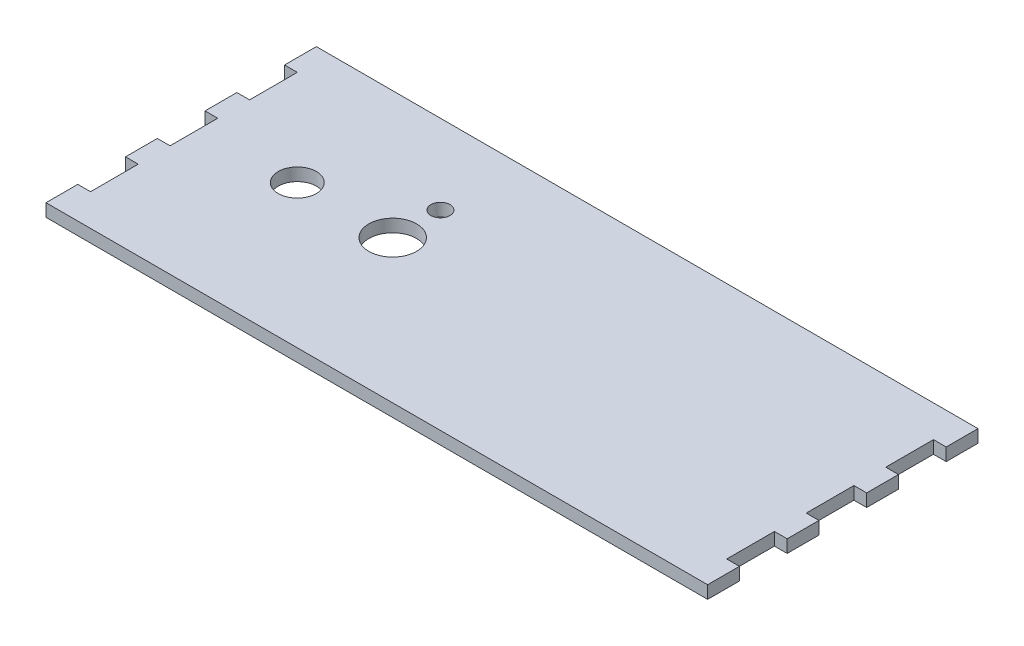
ISO-10303-21;
HEADER;
FILE_DESCRIPTION(('STEP AP214'),'2;1');
FILE_NAME('part.step','',(''),(''),'','','');
FILE_SCHEMA(('AUTOMOTIVE_DESIGN { 1 0 10303 214 1 1 1 1 }'));
ENDSEC;
DATA;
#1=APPLICATION_CONTEXT('core data for automotive mechanical design processes');
#2=APPLICATION_PROTOCOL_DEFINITION('international standard','automotive_design',2000,#1);
#3=PRODUCT_CONTEXT('',#1,'mechanical');
#4=PRODUCT('Part','Part','',(#3));
#5=PRODUCT_RELATED_PRODUCT_CATEGORY('part','',(#4));
#6=PRODUCT_DEFINITION_FORMATION('','',#4);
#7=PRODUCT_DEFINITION_CONTEXT('part definition',#1,'design');
#8=PRODUCT_DEFINITION('design','',#6,#7);
#9=PRODUCT_DEFINITION_SHAPE('','',#8);
#10=(LENGTH_UNIT() NAMED_UNIT(*) SI_UNIT(.MILLI.,.METRE.));
#11=(NAMED_UNIT(*) PLANE_ANGLE_UNIT() SI_UNIT($,.RADIAN.));
#12=(NAMED_UNIT(*) SI_UNIT($,.STERADIAN.) SOLID_ANGLE_UNIT());
#13=UNCERTAINTY_MEASURE_WITH_UNIT(LENGTH_MEASURE(1.E-05),#10,'distance_accuracy_value','');
#14=(GEOMETRIC_REPRESENTATION_CONTEXT(3) GLOBAL_UNCERTAINTY_ASSIGNED_CONTEXT((#13)) GLOBAL_UNIT_ASSIGNED_CONTEXT((#10,
#11,#12)) REPRESENTATION_CONTEXT('',''));
#15=CARTESIAN_POINT('',(0.,0.,0.));
#16=DIRECTION('',(0.,0.,1.));
#17=DIRECTION('',(1.,0.,0.));
#18=AXIS2_PLACEMENT_3D('',#15,#16,#17);
#19=CARTESIAN_POINT('',(-74.9151178897832,4.,-85.));
#20=DIRECTION('',(0.,0.,1.));
#21=DIRECTION('',(1.,0.,0.));
#22=AXIS2_PLACEMENT_3D('',#19,#20,#21);
#23=PLANE('',#22);
#24=DIRECTION('',(-1.,0.,0.));
#25=VECTOR('',#24,1.);
#26=CARTESIAN_POINT('',(-74.9151178897832,0.,-85.));
#27=LINE('',#26,#25);
#28=CARTESIAN_POINT('',(204.,0.,-85.));
#29=VERTEX_POINT('',#28);
#30=CARTESIAN_POINT('',(-4.,0.,-85.));
#31=VERTEX_POINT('',#30);
#32=EDGE_CURVE('E263',#29,#31,#27,.T.);
#33=ORIENTED_EDGE('',*,*,#32,.T.);
#34=DIRECTION('',(0.,-1.,0.));
#35=VECTOR('',#34,1.);
#36=CARTESIAN_POINT('',(-4.,4.,-85.));
#37=LINE('',#36,#35);
#38=CARTESIAN_POINT('',(-4.,4.,-85.));
#39=VERTEX_POINT('',#38);
#40=EDGE_CURVE('E11',#39,#31,#37,.T.);
#41=ORIENTED_EDGE('',*,*,#40,.F.);
#42=DIRECTION('',(-1.,0.,0.));
#43=VECTOR('',#42,1.);
#44=CARTESIAN_POINT('',(-74.9151178897832,4.,-85.));
#45=LINE('',#44,#43);
#46=CARTESIAN_POINT('',(204.,4.,-85.));
#47=VERTEX_POINT('',#46);
#48=EDGE_CURVE('E340',#47,#39,#45,.T.);
#49=ORIENTED_EDGE('',*,*,#48,.F.);
#50=DIRECTION('',(0.,-1.,0.));
#51=VECTOR('',#50,1.);
#52=CARTESIAN_POINT('',(204.,4.,-85.));
#53=LINE('',#52,#51);
#54=EDGE_CURVE('E50',#47,#29,#53,.T.);
#55=ORIENTED_EDGE('',*,*,#54,.T.);
#56=EDGE_LOOP('',(#33,#41,#49,#55));
#57=FACE_BOUND('',#56,.T.);
#58=ADVANCED_FACE('F34',(#57),#23,.F.);
#59=CARTESIAN_POINT('',(-4.,4.,-42.5));
#60=DIRECTION('',(1.,0.,0.));
#61=DIRECTION('',(0.,0.,-1.));
#62=AXIS2_PLACEMENT_3D('',#59,#60,#61);
#63=PLANE('',#62);
#64=DIRECTION('',(0.,0.,1.));
#65=VECTOR('',#64,1.);
#66=CARTESIAN_POINT('',(-4.,0.,-42.5));
#67=LINE('',#66,#65);
#68=CARTESIAN_POINT('',(-4.,0.,-75.));
#69=VERTEX_POINT('',#68);
#70=EDGE_CURVE('E265',#31,#69,#67,.T.);
#71=ORIENTED_EDGE('',*,*,#70,.T.);
#72=DIRECTION('',(0.,-1.,0.));
#73=VECTOR('',#72,1.);
#74=CARTESIAN_POINT('',(-4.,4.,-75.));
#75=LINE('',#74,#73);
#76=CARTESIAN_POINT('',(-4.,4.,-75.));
#77=VERTEX_POINT('',#76);
#78=EDGE_CURVE('E42',#77,#69,#75,.T.);
#79=ORIENTED_EDGE('',*,*,#78,.F.);
#80=DIRECTION('',(0.,0.,1.));
#81=VECTOR('',#80,1.);
#82=CARTESIAN_POINT('',(-4.,4.,-42.5));
#83=LINE('',#82,#81);
#84=EDGE_CURVE('E149',#39,#77,#83,.T.);
#85=ORIENTED_EDGE('',*,*,#84,.F.);
#86=ORIENTED_EDGE('',*,*,#40,.T.);
#87=EDGE_LOOP('',(#71,#79,#85,#86));
#88=FACE_BOUND('',#87,.T.);
#89=ADVANCED_FACE('F399',(#88),#63,.F.);
#90=CARTESIAN_POINT('',(-74.9151178897831,4.,-75.0000000000003));
#91=DIRECTION('',(0.,0.,1.));
#92=DIRECTION('',(1.,0.,0.));
#93=AXIS2_PLACEMENT_3D('',#90,#91,#92);
#94=PLANE('',#93);
#95=DIRECTION('',(-1.,0.,0.));
#96=VECTOR('',#95,1.);
#97=CARTESIAN_POINT('',(-74.9151178897831,0.,-75.0000000000003));
#98=LINE('',#97,#96);
#99=CARTESIAN_POINT('',(0.,0.,-75.));
#100=VERTEX_POINT('',#99);
#101=EDGE_CURVE('E268',#100,#69,#98,.T.);
#102=ORIENTED_EDGE('',*,*,#101,.F.);
#103=DIRECTION('',(0.,-1.,0.));
#104=VECTOR('',#103,1.);
#105=CARTESIAN_POINT('',(0.,4.,-75.));
#106=LINE('',#105,#104);
#107=CARTESIAN_POINT('',(0.,4.,-75.));
#108=VERTEX_POINT('',#107);
#109=EDGE_CURVE('E392',#108,#100,#106,.T.);
#110=ORIENTED_EDGE('',*,*,#109,.F.);
#111=DIRECTION('',(-1.,0.,0.));
#112=VECTOR('',#111,1.);
#113=CARTESIAN_POINT('',(-74.9151178897831,4.,-75.0000000000003));
#114=LINE('',#113,#112);
#115=EDGE_CURVE('E398',#108,#77,#114,.T.);
#116=ORIENTED_EDGE('',*,*,#115,.T.);
#117=ORIENTED_EDGE('',*,*,#78,.T.);
#118=EDGE_LOOP('',(#102,#110,#116,#117));
#119=FACE_BOUND('',#118,.T.);
#120=ADVANCED_FACE('F396',(#119),#94,.T.);
#121=CARTESIAN_POINT('',(0.,4.,-42.5));
#122=DIRECTION('',(-1.,0.,0.));
#123=DIRECTION('',(0.,0.,1.));
#124=AXIS2_PLACEMENT_3D('',#121,#122,#123);
#125=PLANE('',#124);
#126=DIRECTION('',(0.,0.,-1.));
#127=VECTOR('',#126,1.);
#128=CARTESIAN_POINT('',(0.,0.,-42.5));
#129=LINE('',#128,#127);
#130=CARTESIAN_POINT('',(0.,0.,-60.));
#131=VERTEX_POINT('',#130);
#132=EDGE_CURVE('E271',#131,#100,#129,.T.);
#133=ORIENTED_EDGE('',*,*,#132,.F.);
#134=DIRECTION('',(0.,-1.,0.));
#135=VECTOR('',#134,1.);
#136=CARTESIAN_POINT('',(0.,4.,-60.));
#137=LINE('',#136,#135);
#138=CARTESIAN_POINT('',(0.,4.,-60.));
#139=VERTEX_POINT('',#138);
#140=EDGE_CURVE('E390',#139,#131,#137,.T.);
#141=ORIENTED_EDGE('',*,*,#140,.F.);
#142=DIRECTION('',(0.,0.,-1.));
#143=VECTOR('',#142,1.);
#144=CARTESIAN_POINT('',(0.,4.,-42.5));
#145=LINE('',#144,#143);
#146=EDGE_CURVE('E412',#139,#108,#145,.T.);
#147=ORIENTED_EDGE('',*,*,#146,.T.);
#148=ORIENTED_EDGE('',*,*,#109,.T.);
#149=EDGE_LOOP('',(#133,#141,#147,#148));
#150=FACE_BOUND('',#149,.T.);
#151=ADVANCED_FACE('F408',(#150),#125,.T.);
#152=CARTESIAN_POINT('',(-74.9151178897832,4.,-60.));
#153=DIRECTION('',(0.,0.,1.));
#154=DIRECTION('',(1.,0.,0.));
#155=AXIS2_PLACEMENT_3D('',#152,#153,#154);
#156=PLANE('',#155);
#157=DIRECTION('',(-1.,0.,0.));
#158=VECTOR('',#157,1.);
#159=CARTESIAN_POINT('',(-74.9151178897832,0.,-60.));
#160=LINE('',#159,#158);
#161=CARTESIAN_POINT('',(-4.,0.,-60.));
#162=VERTEX_POINT('',#161);
#163=EDGE_CURVE('E274',#131,#162,#160,.T.);
#164=ORIENTED_EDGE('',*,*,#163,.T.);
#165=DIRECTION('',(0.,-1.,0.));
#166=VECTOR('',#165,1.);
#167=CARTESIAN_POINT('',(-4.,4.,-60.));
#168=LINE('',#167,#166);
#169=CARTESIAN_POINT('',(-4.,4.,-60.));
#170=VERTEX_POINT('',#169);
#171=EDGE_CURVE('E387',#170,#162,#168,.T.);
#172=ORIENTED_EDGE('',*,*,#171,.F.);
#173=DIRECTION('',(-1.,0.,0.));
#174=VECTOR('',#173,1.);
#175=CARTESIAN_POINT('',(-74.9151178897832,4.,-60.));
#176=LINE('',#175,#174);
#177=EDGE_CURVE('E414',#139,#170,#176,.T.);
#178=ORIENTED_EDGE('',*,*,#177,.F.);
#179=ORIENTED_EDGE('',*,*,#140,.T.);
#180=EDGE_LOOP('',(#164,#172,#178,#179));
#181=FACE_BOUND('',#180,.T.);
#182=ADVANCED_FACE('F573',(#181),#156,.F.);
#183=CARTESIAN_POINT('',(-4.,4.,-42.5));
#184=DIRECTION('',(1.,0.,0.));
#185=DIRECTION('',(0.,0.,-1.));
#186=AXIS2_PLACEMENT_3D('',#183,#184,#185);
#187=PLANE('',#186);
#188=DIRECTION('',(0.,0.,1.));
#189=VECTOR('',#188,1.);
#190=CARTESIAN_POINT('',(-4.,0.,-42.5));
#191=LINE('',#190,#189);
#192=CARTESIAN_POINT('',(-4.,0.,-50.));
#193=VERTEX_POINT('',#192);
#194=EDGE_CURVE('E278',#162,#193,#191,.T.);
#195=ORIENTED_EDGE('',*,*,#194,.T.);
#196=DIRECTION('',(0.,-1.,0.));
#197=VECTOR('',#196,1.);
#198=CARTESIAN_POINT('',(-4.,4.,-50.));
#199=LINE('',#198,#197);
#200=CARTESIAN_POINT('',(-4.,4.,-50.));
#201=VERTEX_POINT('',#200);
#202=EDGE_CURVE('E385',#201,#193,#199,.T.);
#203=ORIENTED_EDGE('',*,*,#202,.F.);
#204=DIRECTION('',(0.,0.,1.));
#205=VECTOR('',#204,1.);
#206=CARTESIAN_POINT('',(-4.,4.,-42.5));
#207=LINE('',#206,#205);
#208=EDGE_CURVE('E422',#170,#201,#207,.T.);
#209=ORIENTED_EDGE('',*,*,#208,.F.);
#210=ORIENTED_EDGE('',*,*,#171,.T.);
#211=EDGE_LOOP('',(#195,#203,#209,#210));
#212=FACE_BOUND('',#211,.T.);
#213=ADVANCED_FACE('F569',(#212),#187,.F.);
#214=CARTESIAN_POINT('',(-74.9151178897832,4.,-50.));
#215=DIRECTION('',(0.,0.,1.));
#216=DIRECTION('',(1.,0.,0.));
#217=AXIS2_PLACEMENT_3D('',#214,#215,#216);
#218=PLANE('',#217);
#219=DIRECTION('',(-1.,0.,0.));
#220=VECTOR('',#219,1.);
#221=CARTESIAN_POINT('',(-74.9151178897832,0.,-50.));
#222=LINE('',#221,#220);
#223=CARTESIAN_POINT('',(0.,0.,-50.));
#224=VERTEX_POINT('',#223);
#225=EDGE_CURVE('E281',#224,#193,#222,.T.);
#226=ORIENTED_EDGE('',*,*,#225,.F.);
#227=DIRECTION('',(0.,-1.,0.));
#228=VECTOR('',#227,1.);
#229=CARTESIAN_POINT('',(0.,4.,-50.));
#230=LINE('',#229,#228);
#231=CARTESIAN_POINT('',(0.,4.,-50.));
#232=VERTEX_POINT('',#231);
#233=EDGE_CURVE('E383',#232,#224,#230,.T.);
#234=ORIENTED_EDGE('',*,*,#233,.F.);
#235=DIRECTION('',(-1.,0.,0.));
#236=VECTOR('',#235,1.);
#237=CARTESIAN_POINT('',(-74.9151178897832,4.,-50.));
#238=LINE('',#237,#236);
#239=EDGE_CURVE('E424',#232,#201,#238,.T.);
#240=ORIENTED_EDGE('',*,*,#239,.T.);
#241=ORIENTED_EDGE('',*,*,#202,.T.);
#242=EDGE_LOOP('',(#226,#234,#240,#241));
#243=FACE_BOUND('',#242,.T.);
#244=ADVANCED_FACE('F566',(#243),#218,.T.);
#245=CARTESIAN_POINT('',(0.,0.,-35.));
#246=VERTEX_POINT('',#245);
#247=EDGE_CURVE('E276',#246,#224,#129,.T.);
#248=ORIENTED_EDGE('',*,*,#247,.F.);
#249=DIRECTION('',(0.,-1.,0.));
#250=VECTOR('',#249,1.);
#251=CARTESIAN_POINT('',(0.,4.,-35.));
#252=LINE('',#251,#250);
#253=CARTESIAN_POINT('',(0.,4.,-35.));
#254=VERTEX_POINT('',#253);
#255=EDGE_CURVE('E381',#254,#246,#252,.T.);
#256=ORIENTED_EDGE('',*,*,#255,.F.);
#257=EDGE_CURVE('E417',#254,#232,#145,.T.);
#258=ORIENTED_EDGE('',*,*,#257,.T.);
#259=ORIENTED_EDGE('',*,*,#233,.T.);
#260=EDGE_LOOP('',(#248,#256,#258,#259));
#261=FACE_BOUND('',#260,.T.);
#262=ADVANCED_FACE('F554',(#261),#125,.T.);
#263=CARTESIAN_POINT('',(-74.9151178897832,4.,-35.));
#264=DIRECTION('',(0.,0.,1.));
#265=DIRECTION('',(1.,0.,0.));
#266=AXIS2_PLACEMENT_3D('',#263,#264,#265);
#267=PLANE('',#266);
#268=DIRECTION('',(-1.,0.,0.));
#269=VECTOR('',#268,1.);
#270=CARTESIAN_POINT('',(-74.9151178897832,0.,-35.));
#271=LINE('',#270,#269);
#272=CARTESIAN_POINT('',(-4.,0.,-35.));
#273=VERTEX_POINT('',#272);
#274=EDGE_CURVE('E284',#246,#273,#271,.T.);
#275=ORIENTED_EDGE('',*,*,#274,.T.);
#276=DIRECTION('',(0.,-1.,0.));
#277=VECTOR('',#276,1.);
#278=CARTESIAN_POINT('',(-4.,4.,-35.));
#279=LINE('',#278,#277);
#280=CARTESIAN_POINT('',(-4.,4.,-35.));
#281=VERTEX_POINT('',#280);
#282=EDGE_CURVE('E379',#281,#273,#279,.T.);
#283=ORIENTED_EDGE('',*,*,#282,.F.);
#284=DIRECTION('',(-1.,0.,0.));
#285=VECTOR('',#284,1.);
#286=CARTESIAN_POINT('',(-74.9151178897832,4.,-35.));
#287=LINE('',#286,#285);
#288=EDGE_CURVE('E427',#254,#281,#287,.T.);
#289=ORIENTED_EDGE('',*,*,#288,.F.);
#290=ORIENTED_EDGE('',*,*,#255,.T.);
#291=EDGE_LOOP('',(#275,#283,#289,#290));
#292=FACE_BOUND('',#291,.T.);
#293=ADVANCED_FACE('F561',(#292),#267,.F.);
#294=CARTESIAN_POINT('',(-4.,4.,-42.5));
#295=DIRECTION('',(-1.,0.,0.));
#296=DIRECTION('',(0.,0.,1.));
#297=AXIS2_PLACEMENT_3D('',#294,#295,#296);
#298=PLANE('',#297);
#299=DIRECTION('',(0.,0.,-1.));
#300=VECTOR('',#299,1.);
#301=CARTESIAN_POINT('',(-4.,0.,-42.5));
#302=LINE('',#301,#300);
#303=CARTESIAN_POINT('',(-4.,0.,-25.));
#304=VERTEX_POINT('',#303);
#305=EDGE_CURVE('E287',#304,#273,#302,.T.);
#306=ORIENTED_EDGE('',*,*,#305,.F.);
#307=DIRECTION('',(0.,-1.,0.));
#308=VECTOR('',#307,1.);
#309=CARTESIAN_POINT('',(-4.,4.,-25.));
#310=LINE('',#309,#308);
#311=CARTESIAN_POINT('',(-4.,4.,-25.));
#312=VERTEX_POINT('',#311);
#313=EDGE_CURVE('E377',#312,#304,#310,.T.);
#314=ORIENTED_EDGE('',*,*,#313,.F.);
#315=DIRECTION('',(0.,0.,-1.));
#316=VECTOR('',#315,1.);
#317=CARTESIAN_POINT('',(-4.,4.,-42.5));
#318=LINE('',#317,#316);
#319=EDGE_CURVE('E429',#312,#281,#318,.T.);
#320=ORIENTED_EDGE('',*,*,#319,.T.);
#321=ORIENTED_EDGE('',*,*,#282,.T.);
#322=EDGE_LOOP('',(#306,#314,#320,#321));
#323=FACE_BOUND('',#322,.T.);
#324=ADVANCED_FACE('F557',(#323),#298,.T.);
#325=CARTESIAN_POINT('',(-74.9151178897832,4.,-25.));
#326=DIRECTION('',(0.,0.,1.));
#327=DIRECTION('',(1.,0.,0.));
#328=AXIS2_PLACEMENT_3D('',#325,#326,#327);
#329=PLANE('',#328);
#330=DIRECTION('',(-1.,0.,0.));
#331=VECTOR('',#330,1.);
#332=CARTESIAN_POINT('',(-74.9151178897832,0.,-25.));
#333=LINE('',#332,#331);
#334=CARTESIAN_POINT('',(0.,0.,-25.));
#335=VERTEX_POINT('',#334);
#336=EDGE_CURVE('E290',#335,#304,#333,.T.);
#337=ORIENTED_EDGE('',*,*,#336,.F.);
#338=DIRECTION('',(0.,-1.,0.));
#339=VECTOR('',#338,1.);
#340=CARTESIAN_POINT('',(0.,4.,-25.));
#341=LINE('',#340,#339);
#342=CARTESIAN_POINT('',(0.,4.,-25.));
#343=VERTEX_POINT('',#342);
#344=EDGE_CURVE('E375',#343,#335,#341,.T.);
#345=ORIENTED_EDGE('',*,*,#344,.F.);
#346=DIRECTION('',(-1.,0.,0.));
#347=VECTOR('',#346,1.);
#348=CARTESIAN_POINT('',(-74.9151178897832,4.,-25.));
#349=LINE('',#348,#347);
#350=EDGE_CURVE('E432',#343,#312,#349,.T.);
#351=ORIENTED_EDGE('',*,*,#350,.T.);
#352=ORIENTED_EDGE('',*,*,#313,.T.);
#353=EDGE_LOOP('',(#337,#345,#351,#352));
#354=FACE_BOUND('',#353,.T.);
#355=ADVANCED_FACE('F552',(#354),#329,.T.);
#356=CARTESIAN_POINT('',(0.,0.,-9.99999999999999));
#357=VERTEX_POINT('',#356);
#358=EDGE_CURVE('E275',#357,#335,#129,.T.);
#359=ORIENTED_EDGE('',*,*,#358,.F.);
#360=DIRECTION('',(0.,-1.,0.));
#361=VECTOR('',#360,1.);
#362=CARTESIAN_POINT('',(0.,4.,-9.99999999999999));
#363=LINE('',#362,#361);
#364=CARTESIAN_POINT('',(0.,4.,-9.99999999999999));
#365=VERTEX_POINT('',#364);
#366=EDGE_CURVE('E373',#365,#357,#363,.T.);
#367=ORIENTED_EDGE('',*,*,#366,.F.);
#368=EDGE_CURVE('E416',#365,#343,#145,.T.);
#369=ORIENTED_EDGE('',*,*,#368,.T.);
#370=ORIENTED_EDGE('',*,*,#344,.T.);
#371=EDGE_LOOP('',(#359,#367,#369,#370));
#372=FACE_BOUND('',#371,.T.);
#373=ADVANCED_FACE('F548',(#372),#125,.T.);
#374=CARTESIAN_POINT('',(-74.9151178897832,4.,-10.));
#375=DIRECTION('',(0.,0.,1.));
#376=DIRECTION('',(1.,0.,0.));
#377=AXIS2_PLACEMENT_3D('',#374,#375,#376);
#378=PLANE('',#377);
#379=DIRECTION('',(-1.,0.,0.));
#380=VECTOR('',#379,1.);
#381=CARTESIAN_POINT('',(-74.9151178897832,0.,-10.));
#382=LINE('',#381,#380);
#383=CARTESIAN_POINT('',(-4.,0.,-10.));
#384=VERTEX_POINT('',#383);
#385=EDGE_CURVE('E293',#357,#384,#382,.T.);
#386=ORIENTED_EDGE('',*,*,#385,.T.);
#387=DIRECTION('',(0.,-1.,0.));
#388=VECTOR('',#387,1.);
#389=CARTESIAN_POINT('',(-4.,4.,-10.));
#390=LINE('',#389,#388);
#391=CARTESIAN_POINT('',(-4.,4.,-10.));
#392=VERTEX_POINT('',#391);
#393=EDGE_CURVE('E371',#392,#384,#390,.T.);
#394=ORIENTED_EDGE('',*,*,#393,.F.);
#395=DIRECTION('',(-1.,0.,0.));
#396=VECTOR('',#395,1.);
#397=CARTESIAN_POINT('',(-74.9151178897832,4.,-10.));
#398=LINE('',#397,#396);
#399=EDGE_CURVE('E435',#365,#392,#398,.T.);
#400=ORIENTED_EDGE('',*,*,#399,.F.);
#401=ORIENTED_EDGE('',*,*,#366,.T.);
#402=EDGE_LOOP('',(#386,#394,#400,#401));
#403=FACE_BOUND('',#402,.T.);
#404=ADVANCED_FACE('F544',(#403),#378,.F.);
#405=CARTESIAN_POINT('',(-4.,4.,-42.5));
#406=DIRECTION('',(-1.,0.,0.));
#407=DIRECTION('',(0.,0.,1.));
#408=AXIS2_PLACEMENT_3D('',#405,#406,#407);
#409=PLANE('',#408);
#410=DIRECTION('',(0.,0.,-1.));
#411=VECTOR('',#410,1.);
#412=CARTESIAN_POINT('',(-4.,0.,-42.5));
#413=LINE('',#412,#411);
#414=CARTESIAN_POINT('',(-4.,0.,0.));
#415=VERTEX_POINT('',#414);
#416=EDGE_CURVE('E296',#415,#384,#413,.T.);
#417=ORIENTED_EDGE('',*,*,#416,.F.);
#418=DIRECTION('',(0.,-1.,0.));
#419=VECTOR('',#418,1.);
#420=CARTESIAN_POINT('',(-4.,4.,0.));
#421=LINE('',#420,#419);
#422=CARTESIAN_POINT('',(-4.,4.,0.));
#423=VERTEX_POINT('',#422);
#424=EDGE_CURVE('E369',#423,#415,#421,.T.);
#425=ORIENTED_EDGE('',*,*,#424,.F.);
#426=DIRECTION('',(0.,0.,-1.));
#427=VECTOR('',#426,1.);
#428=CARTESIAN_POINT('',(-4.,4.,-42.5));
#429=LINE('',#428,#427);
#430=EDGE_CURVE('E437',#423,#392,#429,.T.);
#431=ORIENTED_EDGE('',*,*,#430,.T.);
#432=ORIENTED_EDGE('',*,*,#393,.T.);
#433=EDGE_LOOP('',(#417,#425,#431,#432));
#434=FACE_BOUND('',#433,.T.);
#435=ADVANCED_FACE('F540',(#434),#409,.T.);
#436=CARTESIAN_POINT('',(-74.9151178897832,4.,0.));
#437=DIRECTION('',(0.,0.,-1.));
#438=DIRECTION('',(-1.,0.,0.));
#439=AXIS2_PLACEMENT_3D('',#436,#437,#438);
#440=PLANE('',#439);
#441=DIRECTION('',(1.,0.,0.));
#442=VECTOR('',#441,1.);
#443=CARTESIAN_POINT('',(-74.9151178897832,0.,0.));
#444=LINE('',#443,#442);
#445=CARTESIAN_POINT('',(204.,0.,0.));
#446=VERTEX_POINT('',#445);
#447=EDGE_CURVE('E299',#415,#446,#444,.T.);
#448=ORIENTED_EDGE('',*,*,#447,.T.);
#449=DIRECTION('',(0.,-1.,0.));
#450=VECTOR('',#449,1.);
#451=CARTESIAN_POINT('',(204.,4.,0.));
#452=LINE('',#451,#450);
#453=CARTESIAN_POINT('',(204.,4.,0.));
#454=VERTEX_POINT('',#453);
#455=EDGE_CURVE('E366',#454,#446,#452,.T.);
#456=ORIENTED_EDGE('',*,*,#455,.F.);
#457=DIRECTION('',(1.,0.,0.));
#458=VECTOR('',#457,1.);
#459=CARTESIAN_POINT('',(-74.9151178897832,4.,0.));
#460=LINE('',#459,#458);
#461=EDGE_CURVE('E440',#423,#454,#460,.T.);
#462=ORIENTED_EDGE('',*,*,#461,.F.);
#463=ORIENTED_EDGE('',*,*,#424,.T.);
#464=EDGE_LOOP('',(#448,#456,#462,#463));
#465=FACE_BOUND('',#464,.T.);
#466=ADVANCED_FACE('F536',(#465),#440,.F.);
#467=CARTESIAN_POINT('',(204.,4.,-42.5));
#468=DIRECTION('',(-1.,0.,0.));
#469=DIRECTION('',(0.,0.,1.));
#470=AXIS2_PLACEMENT_3D('',#467,#468,#469);
#471=PLANE('',#470);
#472=DIRECTION('',(0.,0.,-1.));
#473=VECTOR('',#472,1.);
#474=CARTESIAN_POINT('',(204.,0.,-42.5));
#475=LINE('',#474,#473);
#476=CARTESIAN_POINT('',(204.,0.,-10.));
#477=VERTEX_POINT('',#476);
#478=EDGE_CURVE('E301',#446,#477,#475,.T.);
#479=ORIENTED_EDGE('',*,*,#478,.T.);
#480=DIRECTION('',(0.,-1.,0.));
#481=VECTOR('',#480,1.);
#482=CARTESIAN_POINT('',(204.,4.,-10.));
#483=LINE('',#482,#481);
#484=CARTESIAN_POINT('',(204.,4.,-10.));
#485=VERTEX_POINT('',#484);
#486=EDGE_CURVE('E364',#485,#477,#483,.T.);
#487=ORIENTED_EDGE('',*,*,#486,.F.);
#488=DIRECTION('',(0.,0.,-1.));
#489=VECTOR('',#488,1.);
#490=CARTESIAN_POINT('',(204.,4.,-42.5));
#491=LINE('',#490,#489);
#492=EDGE_CURVE('E442',#454,#485,#491,.T.);
#493=ORIENTED_EDGE('',*,*,#492,.F.);
#494=ORIENTED_EDGE('',*,*,#455,.T.);
#495=EDGE_LOOP('',(#479,#487,#493,#494));
#496=FACE_BOUND('',#495,.T.);
#497=ADVANCED_FACE('F532',(#496),#471,.F.);
#498=CARTESIAN_POINT('',(-74.9151178897832,4.,-10.));
#499=DIRECTION('',(0.,0.,-1.));
#500=DIRECTION('',(-1.,0.,0.));
#501=AXIS2_PLACEMENT_3D('',#498,#499,#500);
#502=PLANE('',#501);
#503=DIRECTION('',(1.,0.,0.));
#504=VECTOR('',#503,1.);
#505=CARTESIAN_POINT('',(-74.9151178897832,0.,-10.));
#506=LINE('',#505,#504);
#507=CARTESIAN_POINT('',(200.,0.,-9.99999999999999));
#508=VERTEX_POINT('',#507);
#509=EDGE_CURVE('E304',#508,#477,#506,.T.);
#510=ORIENTED_EDGE('',*,*,#509,.F.);
#511=DIRECTION('',(0.,-1.,0.));
#512=VECTOR('',#511,1.);
#513=CARTESIAN_POINT('',(200.,4.,-9.99999999999999));
#514=LINE('',#513,#512);
#515=CARTESIAN_POINT('',(200.,4.,-9.99999999999999));
#516=VERTEX_POINT('',#515);
#517=EDGE_CURVE('E362',#516,#508,#514,.T.);
#518=ORIENTED_EDGE('',*,*,#517,.F.);
#519=DIRECTION('',(1.,0.,0.));
#520=VECTOR('',#519,1.);
#521=CARTESIAN_POINT('',(-74.9151178897832,4.,-10.));
#522=LINE('',#521,#520);
#523=EDGE_CURVE('E444',#516,#485,#522,.T.);
#524=ORIENTED_EDGE('',*,*,#523,.T.);
#525=ORIENTED_EDGE('',*,*,#486,.T.);
#526=EDGE_LOOP('',(#510,#518,#524,#525));
#527=FACE_BOUND('',#526,.T.);
#528=ADVANCED_FACE('F511',(#527),#502,.T.);
#529=CARTESIAN_POINT('',(200.,4.,-42.5));
#530=DIRECTION('',(-1.,0.,0.));
#531=DIRECTION('',(0.,0.,1.));
#532=AXIS2_PLACEMENT_3D('',#529,#530,#531);
#533=PLANE('',#532);
#534=DIRECTION('',(0.,0.,-1.));
#535=VECTOR('',#534,1.);
#536=CARTESIAN_POINT('',(200.,0.,-42.5));
#537=LINE('',#536,#535);
#538=CARTESIAN_POINT('',(200.,0.,-25.));
#539=VERTEX_POINT('',#538);
#540=EDGE_CURVE('E307',#508,#539,#537,.T.);
#541=ORIENTED_EDGE('',*,*,#540,.T.);
#542=DIRECTION('',(0.,-1.,0.));
#543=VECTOR('',#542,1.);
#544=CARTESIAN_POINT('',(200.,4.,-25.));
#545=LINE('',#544,#543);
#546=CARTESIAN_POINT('',(200.,4.,-25.));
#547=VERTEX_POINT('',#546);
#548=EDGE_CURVE('E359',#547,#539,#545,.T.);
#549=ORIENTED_EDGE('',*,*,#548,.F.);
#550=DIRECTION('',(0.,0.,-1.));
#551=VECTOR('',#550,1.);
#552=CARTESIAN_POINT('',(200.,4.,-42.5));
#553=LINE('',#552,#551);
#554=EDGE_CURVE('E237',#516,#547,#553,.T.);
#555=ORIENTED_EDGE('',*,*,#554,.F.);
#556=ORIENTED_EDGE('',*,*,#517,.T.);
#557=EDGE_LOOP('',(#541,#549,#555,#556));
#558=FACE_BOUND('',#557,.T.);
#559=ADVANCED_FACE('F506',(#558),#533,.F.);
#560=CARTESIAN_POINT('',(-74.9151178897832,4.,-25.));
#561=DIRECTION('',(0.,0.,-1.));
#562=DIRECTION('',(-1.,0.,0.));
#563=AXIS2_PLACEMENT_3D('',#560,#561,#562);
#564=PLANE('',#563);
#565=DIRECTION('',(1.,0.,0.));
#566=VECTOR('',#565,1.);
#567=CARTESIAN_POINT('',(-74.9151178897832,0.,-25.));
#568=LINE('',#567,#566);
#569=CARTESIAN_POINT('',(204.,0.,-25.));
#570=VERTEX_POINT('',#569);
#571=EDGE_CURVE('E309',#539,#570,#568,.T.);
#572=ORIENTED_EDGE('',*,*,#571,.T.);
#573=DIRECTION('',(0.,-1.,0.));
#574=VECTOR('',#573,1.);
#575=CARTESIAN_POINT('',(204.,4.,-25.));
#576=LINE('',#575,#574);
#577=CARTESIAN_POINT('',(204.,4.,-25.));
#578=VERTEX_POINT('',#577);
#579=EDGE_CURVE('E356',#578,#570,#576,.T.);
#580=ORIENTED_EDGE('',*,*,#579,.F.);
#581=DIRECTION('',(1.,0.,0.));
#582=VECTOR('',#581,1.);
#583=CARTESIAN_POINT('',(-74.9151178897832,4.,-25.));
#584=LINE('',#583,#582);
#585=EDGE_CURVE('E447',#547,#578,#584,.T.);
#586=ORIENTED_EDGE('',*,*,#585,.F.);
#587=ORIENTED_EDGE('',*,*,#548,.T.);
#588=EDGE_LOOP('',(#572,#580,#586,#587));
#589=FACE_BOUND('',#588,.T.);
#590=ADVANCED_FACE('F510',(#589),#564,.F.);
#591=CARTESIAN_POINT('',(204.,4.,-42.5));
#592=DIRECTION('',(-1.,0.,0.));
#593=DIRECTION('',(0.,0.,1.));
#594=AXIS2_PLACEMENT_3D('',#591,#592,#593);
#595=PLANE('',#594);
#596=DIRECTION('',(0.,0.,-1.));
#597=VECTOR('',#596,1.);
#598=CARTESIAN_POINT('',(204.,0.,-42.5));
#599=LINE('',#598,#597);
#600=CARTESIAN_POINT('',(204.,0.,-35.));
#601=VERTEX_POINT('',#600);
#602=EDGE_CURVE('E312',#570,#601,#599,.T.);
#603=ORIENTED_EDGE('',*,*,#602,.T.);
#604=DIRECTION('',(0.,-1.,0.));
#605=VECTOR('',#604,1.);
#606=CARTESIAN_POINT('',(204.,4.,-35.));
#607=LINE('',#606,#605);
#608=CARTESIAN_POINT('',(204.,4.,-35.));
#609=VERTEX_POINT('',#608);
#610=EDGE_CURVE('E354',#609,#601,#607,.T.);
#611=ORIENTED_EDGE('',*,*,#610,.F.);
#612=DIRECTION('',(0.,0.,-1.));
#613=VECTOR('',#612,1.);
#614=CARTESIAN_POINT('',(204.,4.,-42.5));
#615=LINE('',#614,#613);
#616=EDGE_CURVE('E449',#578,#609,#615,.T.);
#617=ORIENTED_EDGE('',*,*,#616,.F.);
#618=ORIENTED_EDGE('',*,*,#579,.T.);
#619=EDGE_LOOP('',(#603,#611,#617,#618));
#620=FACE_BOUND('',#619,.T.);
#621=ADVANCED_FACE('F518',(#620),#595,.F.);
#622=CARTESIAN_POINT('',(-74.9151178897832,4.,-35.));
#623=DIRECTION('',(0.,0.,-1.));
#624=DIRECTION('',(-1.,0.,0.));
#625=AXIS2_PLACEMENT_3D('',#622,#623,#624);
#626=PLANE('',#625);
#627=DIRECTION('',(1.,0.,0.));
#628=VECTOR('',#627,1.);
#629=CARTESIAN_POINT('',(-74.9151178897832,0.,-35.));
#630=LINE('',#629,#628);
#631=CARTESIAN_POINT('',(200.,0.,-35.));
#632=VERTEX_POINT('',#631);
#633=EDGE_CURVE('E315',#632,#601,#630,.T.);
#634=ORIENTED_EDGE('',*,*,#633,.F.);
#635=DIRECTION('',(0.,-1.,0.));
#636=VECTOR('',#635,1.);
#637=CARTESIAN_POINT('',(200.,4.,-35.));
#638=LINE('',#637,#636);
#639=CARTESIAN_POINT('',(200.,4.,-35.));
#640=VERTEX_POINT('',#639);
#641=EDGE_CURVE('E352',#640,#632,#638,.T.);
#642=ORIENTED_EDGE('',*,*,#641,.F.);
#643=DIRECTION('',(1.,0.,0.));
#644=VECTOR('',#643,1.);
#645=CARTESIAN_POINT('',(-74.9151178897832,4.,-35.));
#646=LINE('',#645,#644);
#647=EDGE_CURVE('E451',#640,#609,#646,.T.);
#648=ORIENTED_EDGE('',*,*,#647,.T.);
#649=ORIENTED_EDGE('',*,*,#610,.T.);
#650=EDGE_LOOP('',(#634,#642,#648,#649));
#651=FACE_BOUND('',#650,.T.);
#652=ADVANCED_FACE('F514',(#651),#626,.T.);
#653=CARTESIAN_POINT('',(200.,0.,-50.));
#654=VERTEX_POINT('',#653);
#655=EDGE_CURVE('E310',#632,#654,#537,.T.);
#656=ORIENTED_EDGE('',*,*,#655,.T.);
#657=DIRECTION('',(0.,-1.,0.));
#658=VECTOR('',#657,1.);
#659=CARTESIAN_POINT('',(200.,4.,-50.));
#660=LINE('',#659,#658);
#661=CARTESIAN_POINT('',(200.,4.,-50.));
#662=VERTEX_POINT('',#661);
#663=EDGE_CURVE('E349',#662,#654,#660,.T.);
#664=ORIENTED_EDGE('',*,*,#663,.F.);
#665=EDGE_CURVE('E236',#640,#662,#553,.T.);
#666=ORIENTED_EDGE('',*,*,#665,.F.);
#667=ORIENTED_EDGE('',*,*,#641,.T.);
#668=EDGE_LOOP('',(#656,#664,#666,#667));
#669=FACE_BOUND('',#668,.T.);
#670=ADVANCED_FACE('F465',(#669),#533,.F.);
#671=CARTESIAN_POINT('',(-74.9151178897832,4.,-50.));
#672=DIRECTION('',(0.,0.,-1.));
#673=DIRECTION('',(-1.,0.,0.));
#674=AXIS2_PLACEMENT_3D('',#671,#672,#673);
#675=PLANE('',#674);
#676=DIRECTION('',(1.,0.,0.));
#677=VECTOR('',#676,1.);
#678=CARTESIAN_POINT('',(-74.9151178897832,0.,-50.));
#679=LINE('',#678,#677);
#680=CARTESIAN_POINT('',(204.,0.,-50.));
#681=VERTEX_POINT('',#680);
#682=EDGE_CURVE('E318',#654,#681,#679,.T.);
#683=ORIENTED_EDGE('',*,*,#682,.T.);
#684=DIRECTION('',(0.,-1.,0.));
#685=VECTOR('',#684,1.);
#686=CARTESIAN_POINT('',(204.,4.,-50.));
#687=LINE('',#686,#685);
#688=CARTESIAN_POINT('',(204.,4.,-50.));
#689=VERTEX_POINT('',#688);
#690=EDGE_CURVE('E346',#689,#681,#687,.T.);
#691=ORIENTED_EDGE('',*,*,#690,.F.);
#692=DIRECTION('',(1.,0.,0.));
#693=VECTOR('',#692,1.);
#694=CARTESIAN_POINT('',(-74.9151178897832,4.,-50.));
#695=LINE('',#694,#693);
#696=EDGE_CURVE('E454',#662,#689,#695,.T.);
#697=ORIENTED_EDGE('',*,*,#696,.F.);
#698=ORIENTED_EDGE('',*,*,#663,.T.);
#699=EDGE_LOOP('',(#683,#691,#697,#698));
#700=FACE_BOUND('',#699,.T.);
#701=ADVANCED_FACE('F471',(#700),#675,.F.);
#702=CARTESIAN_POINT('',(204.,4.,-42.5));
#703=DIRECTION('',(-1.,0.,0.));
#704=DIRECTION('',(0.,0.,1.));
#705=AXIS2_PLACEMENT_3D('',#702,#703,#704);
#706=PLANE('',#705);
#707=DIRECTION('',(0.,0.,-1.));
#708=VECTOR('',#707,1.);
#709=CARTESIAN_POINT('',(204.,0.,-42.5));
#710=LINE('',#709,#708);
#711=CARTESIAN_POINT('',(204.,0.,-60.));
#712=VERTEX_POINT('',#711);
#713=EDGE_CURVE('E320',#681,#712,#710,.T.);
#714=ORIENTED_EDGE('',*,*,#713,.T.);
#715=DIRECTION('',(0.,-1.,0.));
#716=VECTOR('',#715,1.);
#717=CARTESIAN_POINT('',(204.,4.,-60.));
#718=LINE('',#717,#716);
#719=CARTESIAN_POINT('',(204.,4.,-60.));
#720=VERTEX_POINT('',#719);
#721=EDGE_CURVE('E344',#720,#712,#718,.T.);
#722=ORIENTED_EDGE('',*,*,#721,.F.);
#723=DIRECTION('',(0.,0.,-1.));
#724=VECTOR('',#723,1.);
#725=CARTESIAN_POINT('',(204.,4.,-42.5));
#726=LINE('',#725,#724);
#727=EDGE_CURVE('E455',#689,#720,#726,.T.);
#728=ORIENTED_EDGE('',*,*,#727,.F.);
#729=ORIENTED_EDGE('',*,*,#690,.T.);
#730=EDGE_LOOP('',(#714,#722,#728,#729));
#731=FACE_BOUND('',#730,.T.);
#732=ADVANCED_FACE('F474',(#731),#706,.F.);
#733=CARTESIAN_POINT('',(-74.9151178897832,4.,-60.));
#734=DIRECTION('',(0.,0.,-1.));
#735=DIRECTION('',(-1.,0.,0.));
#736=AXIS2_PLACEMENT_3D('',#733,#734,#735);
#737=PLANE('',#736);
#738=DIRECTION('',(1.,0.,0.));
#739=VECTOR('',#738,1.);
#740=CARTESIAN_POINT('',(-74.9151178897832,0.,-60.));
#741=LINE('',#740,#739);
#742=CARTESIAN_POINT('',(200.,0.,-60.));
#743=VERTEX_POINT('',#742);
#744=EDGE_CURVE('E323',#743,#712,#741,.T.);
#745=ORIENTED_EDGE('',*,*,#744,.F.);
#746=DIRECTION('',(0.,-1.,0.));
#747=VECTOR('',#746,1.);
#748=CARTESIAN_POINT('',(200.,4.,-60.));
#749=LINE('',#748,#747);
#750=CARTESIAN_POINT('',(200.,4.,-60.));
#751=VERTEX_POINT('',#750);
#752=EDGE_CURVE('E245',#751,#743,#749,.T.);
#753=ORIENTED_EDGE('',*,*,#752,.F.);
#754=DIRECTION('',(1.,0.,0.));
#755=VECTOR('',#754,1.);
#756=CARTESIAN_POINT('',(-74.9151178897832,4.,-60.));
#757=LINE('',#756,#755);
#758=EDGE_CURVE('E233',#751,#720,#757,.T.);
#759=ORIENTED_EDGE('',*,*,#758,.T.);
#760=ORIENTED_EDGE('',*,*,#721,.T.);
#761=EDGE_LOOP('',(#745,#753,#759,#760));
#762=FACE_BOUND('',#761,.T.);
#763=ADVANCED_FACE('F460',(#762),#737,.T.);
#764=CARTESIAN_POINT('',(200.,0.,-75.));
#765=VERTEX_POINT('',#764);
#766=EDGE_CURVE('E242',#743,#765,#537,.T.);
#767=ORIENTED_EDGE('',*,*,#766,.T.);
#768=DIRECTION('',(0.,-1.,0.));
#769=VECTOR('',#768,1.);
#770=CARTESIAN_POINT('',(200.,4.,-75.));
#771=LINE('',#770,#769);
#772=CARTESIAN_POINT('',(200.,4.,-75.));
#773=VERTEX_POINT('',#772);
#774=EDGE_CURVE('E239',#773,#765,#771,.T.);
#775=ORIENTED_EDGE('',*,*,#774,.F.);
#776=EDGE_CURVE('E225',#751,#773,#553,.T.);
#777=ORIENTED_EDGE('',*,*,#776,.F.);
#778=ORIENTED_EDGE('',*,*,#752,.T.);
#779=EDGE_LOOP('',(#767,#775,#777,#778));
#780=FACE_BOUND('',#779,.T.);
#781=ADVANCED_FACE('F240',(#780),#533,.F.);
#782=CARTESIAN_POINT('',(-74.9151178897832,4.,-75.));
#783=DIRECTION('',(0.,0.,-1.));
#784=DIRECTION('',(-1.,0.,0.));
#785=AXIS2_PLACEMENT_3D('',#782,#783,#784);
#786=PLANE('',#785);
#787=DIRECTION('',(1.,0.,0.));
#788=VECTOR('',#787,1.);
#789=CARTESIAN_POINT('',(-74.9151178897832,0.,-75.));
#790=LINE('',#789,#788);
#791=CARTESIAN_POINT('',(204.,0.,-75.));
#792=VERTEX_POINT('',#791);
#793=EDGE_CURVE('E326',#765,#792,#790,.T.);
#794=ORIENTED_EDGE('',*,*,#793,.T.);
#795=DIRECTION('',(0.,-1.,0.));
#796=VECTOR('',#795,1.);
#797=CARTESIAN_POINT('',(204.,4.,-75.));
#798=LINE('',#797,#796);
#799=CARTESIAN_POINT('',(204.,4.,-75.));
#800=VERTEX_POINT('',#799);
#801=EDGE_CURVE('E137',#800,#792,#798,.T.);
#802=ORIENTED_EDGE('',*,*,#801,.F.);
#803=DIRECTION('',(1.,0.,0.));
#804=VECTOR('',#803,1.);
#805=CARTESIAN_POINT('',(-74.9151178897832,4.,-75.));
#806=LINE('',#805,#804);
#807=EDGE_CURVE('E231',#773,#800,#806,.T.);
#808=ORIENTED_EDGE('',*,*,#807,.F.);
#809=ORIENTED_EDGE('',*,*,#774,.T.);
#810=EDGE_LOOP('',(#794,#802,#808,#809));
#811=FACE_BOUND('',#810,.T.);
#812=ADVANCED_FACE('F247',(#811),#786,.F.);
#813=CARTESIAN_POINT('',(60.,4.,-45.));
#814=DIRECTION('',(0.,-1.,0.));
#815=DIRECTION('',(0.,0.,-1.));
#816=AXIS2_PLACEMENT_3D('',#813,#814,#815);
#817=CYLINDRICAL_SURFACE('',#816,7.50000000000001);
#818=CARTESIAN_POINT('',(60.,4.,-45.));
#819=DIRECTION('',(0.,1.,0.));
#820=DIRECTION('',(0.,0.,1.));
#821=AXIS2_PLACEMENT_3D('',#818,#819,#820);
#822=CIRCLE('',#821,7.50000000000001);
#823=CARTESIAN_POINT('',(60.,4.,-37.5));
#824=VERTEX_POINT('',#823);
#825=EDGE_CURVE('E257',#824,#824,#822,.T.);
#826=ORIENTED_EDGE('',*,*,#825,.T.);
#827=EDGE_LOOP('',(#826));
#828=FACE_BOUND('',#827,.T.);
#829=CARTESIAN_POINT('',(60.,0.,-45.));
#830=DIRECTION('',(0.,1.,0.));
#831=DIRECTION('',(0.,0.,1.));
#832=AXIS2_PLACEMENT_3D('',#829,#830,#831);
#833=CIRCLE('',#832,7.50000000000001);
#834=CARTESIAN_POINT('',(60.,0.,-37.5));
#835=VERTEX_POINT('',#834);
#836=EDGE_CURVE('E334',#835,#835,#833,.T.);
#837=ORIENTED_EDGE('',*,*,#836,.F.);
#838=EDGE_LOOP('',(#837));
#839=FACE_BOUND('',#838,.T.);
#840=ADVANCED_FACE('F498',(#828,#839),#817,.F.);
#841=CARTESIAN_POINT('',(60.,4.,-60.));
#842=DIRECTION('',(0.,-1.,0.));
#843=DIRECTION('',(0.,0.,-1.));
#844=AXIS2_PLACEMENT_3D('',#841,#842,#843);
#845=CYLINDRICAL_SURFACE('',#844,3.00000000000001);
#846=CARTESIAN_POINT('',(60.,4.,-60.));
#847=DIRECTION('',(0.,1.,0.));
#848=DIRECTION('',(0.,0.,1.));
#849=AXIS2_PLACEMENT_3D('',#846,#847,#848);
#850=CIRCLE('',#849,3.00000000000001);
#851=CARTESIAN_POINT('',(60.,4.,-57.));
#852=VERTEX_POINT('',#851);
#853=EDGE_CURVE('E250',#852,#852,#850,.T.);
#854=ORIENTED_EDGE('',*,*,#853,.T.);
#855=EDGE_LOOP('',(#854));
#856=FACE_BOUND('',#855,.T.);
#857=CARTESIAN_POINT('',(60.,0.,-60.));
#858=DIRECTION('',(0.,1.,0.));
#859=DIRECTION('',(0.,0.,1.));
#860=AXIS2_PLACEMENT_3D('',#857,#858,#859);
#861=CIRCLE('',#860,3.00000000000001);
#862=CARTESIAN_POINT('',(60.,0.,-57.));
#863=VERTEX_POINT('',#862);
#864=EDGE_CURVE('E331',#863,#863,#861,.T.);
#865=ORIENTED_EDGE('',*,*,#864,.F.);
#866=EDGE_LOOP('',(#865));
#867=FACE_BOUND('',#866,.T.);
#868=ADVANCED_FACE('F490',(#856,#867),#845,.F.);
#869=CARTESIAN_POINT('',(204.,4.,-42.5000000000008));
#870=DIRECTION('',(1.,0.,0.));
#871=DIRECTION('',(0.,0.,-1.));
#872=AXIS2_PLACEMENT_3D('',#869,#870,#871);
#873=PLANE('',#872);
#874=DIRECTION('',(0.,0.,1.));
#875=VECTOR('',#874,1.);
#876=CARTESIAN_POINT('',(204.,0.,-42.5000000000008));
#877=LINE('',#876,#875);
#878=EDGE_CURVE('E328',#29,#792,#877,.T.);
#879=ORIENTED_EDGE('',*,*,#878,.F.);
#880=ORIENTED_EDGE('',*,*,#54,.F.);
#881=DIRECTION('',(0.,0.,1.));
#882=VECTOR('',#881,1.);
#883=CARTESIAN_POINT('',(204.,4.,-42.5000000000008));
#884=LINE('',#883,#882);
#885=EDGE_CURVE('E248',#47,#800,#884,.T.);
#886=ORIENTED_EDGE('',*,*,#885,.T.);
#887=ORIENTED_EDGE('',*,*,#801,.T.);
#888=EDGE_LOOP('',(#879,#880,#886,#887));
#889=FACE_BOUND('',#888,.T.);
#890=ADVANCED_FACE('F487',(#889),#873,.T.);
#891=CARTESIAN_POINT('',(30.,4.,-45.));
#892=DIRECTION('',(0.,-1.,0.));
#893=DIRECTION('',(0.,0.,-1.));
#894=AXIS2_PLACEMENT_3D('',#891,#892,#893);
#895=CYLINDRICAL_SURFACE('',#894,6.);
#896=CARTESIAN_POINT('',(30.,4.,-45.));
#897=DIRECTION('',(0.,1.,0.));
#898=DIRECTION('',(0.,0.,1.));
#899=AXIS2_PLACEMENT_3D('',#896,#897,#898);
#900=CIRCLE('',#899,6.);
#901=CARTESIAN_POINT('',(30.,4.,-39.));
#902=VERTEX_POINT('',#901);
#903=EDGE_CURVE('E260',#902,#902,#900,.T.);
#904=ORIENTED_EDGE('',*,*,#903,.T.);
#905=EDGE_LOOP('',(#904));
#906=FACE_BOUND('',#905,.T.);
#907=CARTESIAN_POINT('',(30.,0.,-45.));
#908=DIRECTION('',(0.,1.,0.));
#909=DIRECTION('',(0.,0.,1.));
#910=AXIS2_PLACEMENT_3D('',#907,#908,#909);
#911=CIRCLE('',#910,6.);
#912=CARTESIAN_POINT('',(30.,0.,-39.));
#913=VERTEX_POINT('',#912);
#914=EDGE_CURVE('E337',#913,#913,#911,.T.);
#915=ORIENTED_EDGE('',*,*,#914,.F.);
#916=EDGE_LOOP('',(#915));
#917=FACE_BOUND('',#916,.T.);
#918=ADVANCED_FACE('F489',(#906,#917),#895,.F.);
#919=CARTESIAN_POINT('',(-74.9151178897832,4.,-42.5));
#920=DIRECTION('',(0.,1.,0.));
#921=DIRECTION('',(0.,0.,1.));
#922=AXIS2_PLACEMENT_3D('',#919,#920,#921);
#923=PLANE('',#922);
#924=ORIENTED_EDGE('',*,*,#48,.T.);
#925=ORIENTED_EDGE('',*,*,#84,.T.);
#926=ORIENTED_EDGE('',*,*,#115,.F.);
#927=ORIENTED_EDGE('',*,*,#146,.F.);
#928=ORIENTED_EDGE('',*,*,#177,.T.);
#929=ORIENTED_EDGE('',*,*,#208,.T.);
#930=ORIENTED_EDGE('',*,*,#239,.F.);
#931=ORIENTED_EDGE('',*,*,#257,.F.);
#932=ORIENTED_EDGE('',*,*,#288,.T.);
#933=ORIENTED_EDGE('',*,*,#319,.F.);
#934=ORIENTED_EDGE('',*,*,#350,.F.);
#935=ORIENTED_EDGE('',*,*,#368,.F.);
#936=ORIENTED_EDGE('',*,*,#399,.T.);
#937=ORIENTED_EDGE('',*,*,#430,.F.);
#938=ORIENTED_EDGE('',*,*,#461,.T.);
#939=ORIENTED_EDGE('',*,*,#492,.T.);
#940=ORIENTED_EDGE('',*,*,#523,.F.);
#941=ORIENTED_EDGE('',*,*,#554,.T.);
#942=ORIENTED_EDGE('',*,*,#585,.T.);
#943=ORIENTED_EDGE('',*,*,#616,.T.);
#944=ORIENTED_EDGE('',*,*,#647,.F.);
#945=ORIENTED_EDGE('',*,*,#665,.T.);
#946=ORIENTED_EDGE('',*,*,#696,.T.);
#947=ORIENTED_EDGE('',*,*,#727,.T.);
#948=ORIENTED_EDGE('',*,*,#758,.F.);
#949=ORIENTED_EDGE('',*,*,#776,.T.);
#950=ORIENTED_EDGE('',*,*,#807,.T.);
#951=ORIENTED_EDGE('',*,*,#885,.F.);
#952=EDGE_LOOP('',(#924,#925,#926,#927,#928,#929,#930,#931,#932,#933,#934,#935,#936,#937,#938,
#939,#940,#941,#942,#943,#944,#945,#946,#947,#948,#949,#950,#951));
#953=FACE_BOUND('',#952,.T.);
#954=ORIENTED_EDGE('',*,*,#853,.F.);
#955=EDGE_LOOP('',(#954));
#956=FACE_BOUND('',#955,.T.);
#957=ORIENTED_EDGE('',*,*,#825,.F.);
#958=EDGE_LOOP('',(#957));
#959=FACE_BOUND('',#958,.T.);
#960=ORIENTED_EDGE('',*,*,#903,.F.);
#961=EDGE_LOOP('',(#960));
#962=FACE_BOUND('',#961,.T.);
#963=ADVANCED_FACE('F227',(#953,#956,#959,#962),#923,.T.);
#964=CARTESIAN_POINT('',(-74.9151178897832,0.,-42.5));
#965=DIRECTION('',(0.,1.,0.));
#966=DIRECTION('',(0.,0.,1.));
#967=AXIS2_PLACEMENT_3D('',#964,#965,#966);
#968=PLANE('',#967);
#969=ORIENTED_EDGE('',*,*,#32,.F.);
#970=ORIENTED_EDGE('',*,*,#878,.T.);
#971=ORIENTED_EDGE('',*,*,#793,.F.);
#972=ORIENTED_EDGE('',*,*,#766,.F.);
#973=ORIENTED_EDGE('',*,*,#744,.T.);
#974=ORIENTED_EDGE('',*,*,#713,.F.);
#975=ORIENTED_EDGE('',*,*,#682,.F.);
#976=ORIENTED_EDGE('',*,*,#655,.F.);
#977=ORIENTED_EDGE('',*,*,#633,.T.);
#978=ORIENTED_EDGE('',*,*,#602,.F.);
#979=ORIENTED_EDGE('',*,*,#571,.F.);
#980=ORIENTED_EDGE('',*,*,#540,.F.);
#981=ORIENTED_EDGE('',*,*,#509,.T.);
#982=ORIENTED_EDGE('',*,*,#478,.F.);
#983=ORIENTED_EDGE('',*,*,#447,.F.);
#984=ORIENTED_EDGE('',*,*,#416,.T.);
#985=ORIENTED_EDGE('',*,*,#385,.F.);
#986=ORIENTED_EDGE('',*,*,#358,.T.);
#987=ORIENTED_EDGE('',*,*,#336,.T.);
#988=ORIENTED_EDGE('',*,*,#305,.T.);
#989=ORIENTED_EDGE('',*,*,#274,.F.);
#990=ORIENTED_EDGE('',*,*,#247,.T.);
#991=ORIENTED_EDGE('',*,*,#225,.T.);
#992=ORIENTED_EDGE('',*,*,#194,.F.);
#993=ORIENTED_EDGE('',*,*,#163,.F.);
#994=ORIENTED_EDGE('',*,*,#132,.T.);
#995=ORIENTED_EDGE('',*,*,#101,.T.);
#996=ORIENTED_EDGE('',*,*,#70,.F.);
#997=EDGE_LOOP('',(#969,#970,#971,#972,#973,#974,#975,#976,#977,#978,#979,#980,#981,#982,#983,
#984,#985,#986,#987,#988,#989,#990,#991,#992,#993,#994,#995,#996));
#998=FACE_BOUND('',#997,.T.);
#999=ORIENTED_EDGE('',*,*,#864,.T.);
#1000=EDGE_LOOP('',(#999));
#1001=FACE_BOUND('',#1000,.T.);
#1002=ORIENTED_EDGE('',*,*,#836,.T.);
#1003=EDGE_LOOP('',(#1002));
#1004=FACE_BOUND('',#1003,.T.);
#1005=ORIENTED_EDGE('',*,*,#914,.T.);
#1006=EDGE_LOOP('',(#1005));
#1007=FACE_BOUND('',#1006,.T.);
#1008=ADVANCED_FACE('F402',(#998,#1001,#1004,#1007),#968,.F.);
#1009=CLOSED_SHELL('',(#58,#89,#120,#151,#182,#213,#244,#262,#293,#324,#355,#373,#404,#435,#466,
#497,#528,#559,#590,#621,#652,#670,#701,#732,#763,#781,#812,#840,#868,#890,#918,#963,#1008));
#1010=MANIFOLD_SOLID_BREP('B2',#1009);
#1011=ADVANCED_BREP_SHAPE_REPRESENTATION('',(#18,#1010),#14);
#1012=SHAPE_DEFINITION_REPRESENTATION(#9,#1011);
ENDSEC;
END-ISO-10303-21;
